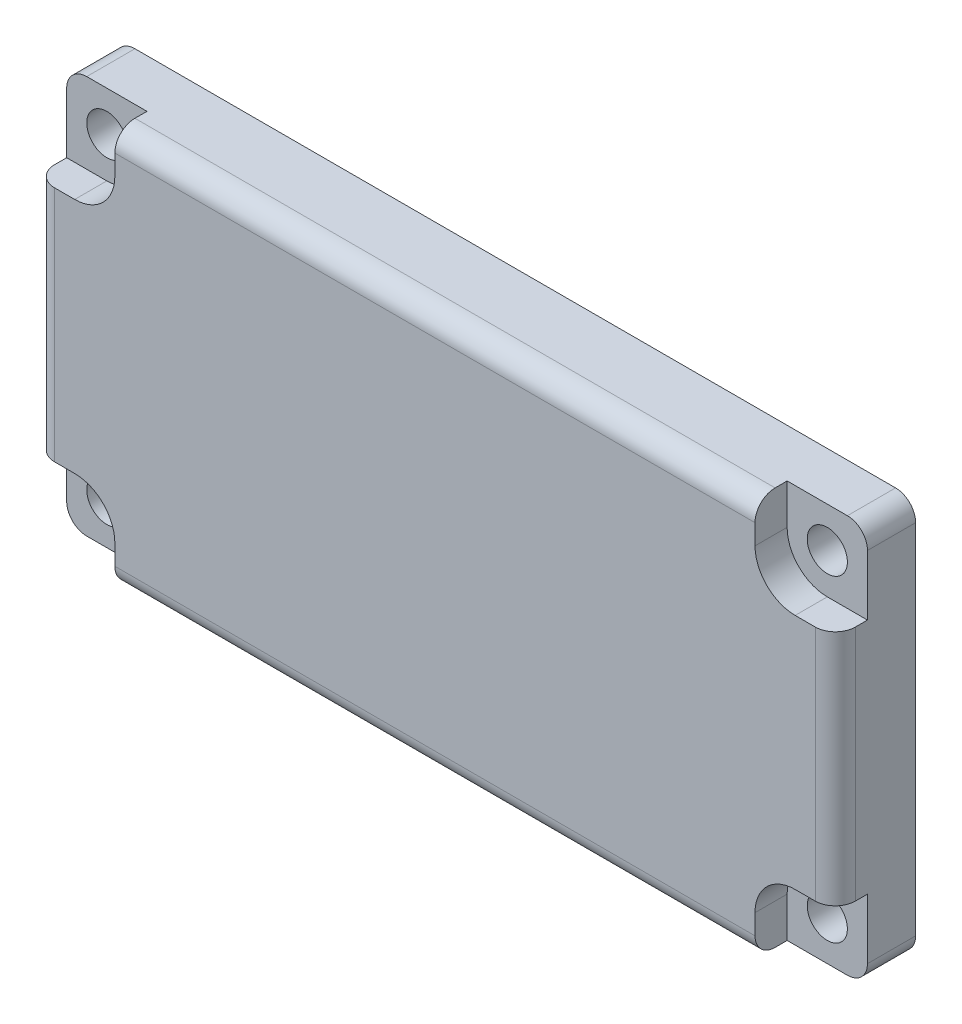
ISO-10303-21;
HEADER;
FILE_DESCRIPTION(('STEP AP214'),'2;1');
FILE_NAME('part.step','',(''),(''),'','','');
FILE_SCHEMA(('AUTOMOTIVE_DESIGN { 1 0 10303 214 1 1 1 1 }'));
ENDSEC;
DATA;
#1=APPLICATION_CONTEXT('core data for automotive mechanical design processes');
#2=APPLICATION_PROTOCOL_DEFINITION('international standard','automotive_design',2000,#1);
#3=PRODUCT_CONTEXT('',#1,'mechanical');
#4=PRODUCT('Part','Part','',(#3));
#5=PRODUCT_RELATED_PRODUCT_CATEGORY('part','',(#4));
#6=PRODUCT_DEFINITION_FORMATION('','',#4);
#7=PRODUCT_DEFINITION_CONTEXT('part definition',#1,'design');
#8=PRODUCT_DEFINITION('design','',#6,#7);
#9=PRODUCT_DEFINITION_SHAPE('','',#8);
#10=(LENGTH_UNIT() NAMED_UNIT(*) SI_UNIT(.MILLI.,.METRE.));
#11=(NAMED_UNIT(*) PLANE_ANGLE_UNIT() SI_UNIT($,.RADIAN.));
#12=(NAMED_UNIT(*) SI_UNIT($,.STERADIAN.) SOLID_ANGLE_UNIT());
#13=UNCERTAINTY_MEASURE_WITH_UNIT(LENGTH_MEASURE(1.E-05),#10,'distance_accuracy_value','');
#14=(GEOMETRIC_REPRESENTATION_CONTEXT(3) GLOBAL_UNCERTAINTY_ASSIGNED_CONTEXT((#13)) GLOBAL_UNIT_ASSIGNED_CONTEXT((#10,
#11,#12)) REPRESENTATION_CONTEXT('',''));
#15=CARTESIAN_POINT('',(0.,0.,0.));
#16=DIRECTION('',(0.,0.,1.));
#17=DIRECTION('',(1.,0.,0.));
#18=AXIS2_PLACEMENT_3D('',#15,#16,#17);
#19=CARTESIAN_POINT('',(19.94,-5.90999999999998,4.));
#20=DIRECTION('',(0.,-1.,0.));
#21=DIRECTION('',(0.,0.,-1.));
#22=AXIS2_PLACEMENT_3D('',#19,#20,#21);
#23=PLANE('',#22);
#24=DIRECTION('',(1.,0.,0.));
#25=VECTOR('',#24,1.);
#26=CARTESIAN_POINT('',(18.0777343274796,-5.90999999999998,2.4));
#27=LINE('',#26,#25);
#28=CARTESIAN_POINT('',(19.94,-5.90999999999998,2.4));
#29=VERTEX_POINT('',#28);
#30=CARTESIAN_POINT('',(17.94,-5.90999999999998,2.4));
#31=VERTEX_POINT('',#30);
#32=EDGE_CURVE('E172',#29,#31,#27,.F.);
#33=ORIENTED_EDGE('',*,*,#32,.F.);
#34=DIRECTION('',(0.,0.,-1.));
#35=VECTOR('',#34,1.);
#36=CARTESIAN_POINT('',(19.94,-5.90999999999998,4.));
#37=LINE('',#36,#35);
#38=CARTESIAN_POINT('',(19.94,-5.90999999999998,2.99999999999999));
#39=VERTEX_POINT('',#38);
#40=EDGE_CURVE('E170',#29,#39,#37,.F.);
#41=ORIENTED_EDGE('',*,*,#40,.T.);
#42=CARTESIAN_POINT('',(18.94,-5.90999999999998,2.99999999999999));
#43=DIRECTION('',(0.,-1.,0.));
#44=DIRECTION('',(0.,0.,-1.));
#45=AXIS2_PLACEMENT_3D('',#42,#43,#44);
#46=CIRCLE('',#45,1.);
#47=CARTESIAN_POINT('',(18.94,-5.90999999999998,4.));
#48=VERTEX_POINT('',#47);
#49=EDGE_CURVE('E20',#39,#48,#46,.T.);
#50=ORIENTED_EDGE('',*,*,#49,.T.);
#51=DIRECTION('',(1.,0.,0.));
#52=VECTOR('',#51,1.);
#53=CARTESIAN_POINT('',(19.94,-5.90999999999998,4.));
#54=LINE('',#53,#52);
#55=CARTESIAN_POINT('',(17.94,-5.90999999999998,4.));
#56=VERTEX_POINT('',#55);
#57=EDGE_CURVE('E152',#48,#56,#54,.F.);
#58=ORIENTED_EDGE('',*,*,#57,.T.);
#59=DIRECTION('',(0.,0.,-1.));
#60=VECTOR('',#59,1.);
#61=CARTESIAN_POINT('',(17.94,-5.90999999999998,4.));
#62=LINE('',#61,#60);
#63=EDGE_CURVE('E160',#56,#31,#62,.T.);
#64=ORIENTED_EDGE('',*,*,#63,.T.);
#65=EDGE_LOOP('',(#33,#41,#50,#58,#64));
#66=FACE_BOUND('',#65,.T.);
#67=ADVANCED_FACE('F17',(#66),#23,.T.);
#68=CARTESIAN_POINT('',(15.94,-7.90999999999999,4.));
#69=DIRECTION('',(1.,0.,0.));
#70=DIRECTION('',(0.,0.,-1.));
#71=AXIS2_PLACEMENT_3D('',#68,#69,#70);
#72=PLANE('',#71);
#73=DIRECTION('',(0.,0.,-1.));
#74=VECTOR('',#73,1.);
#75=CARTESIAN_POINT('',(15.94,-7.90999999999999,4.));
#76=LINE('',#75,#74);
#77=CARTESIAN_POINT('',(15.94,-7.90999999999999,2.4));
#78=VERTEX_POINT('',#77);
#79=CARTESIAN_POINT('',(15.94,-7.90999999999999,4.));
#80=VERTEX_POINT('',#79);
#81=EDGE_CURVE('E183',#78,#80,#76,.F.);
#82=ORIENTED_EDGE('',*,*,#81,.T.);
#83=DIRECTION('',(0.,1.,0.));
#84=VECTOR('',#83,1.);
#85=CARTESIAN_POINT('',(15.94,-7.90999999999999,4.));
#86=LINE('',#85,#84);
#87=CARTESIAN_POINT('',(15.94,-8.91,4.));
#88=VERTEX_POINT('',#87);
#89=EDGE_CURVE('E298',#80,#88,#86,.F.);
#90=ORIENTED_EDGE('',*,*,#89,.T.);
#91=CARTESIAN_POINT('',(15.94,-8.91,2.99999999999999));
#92=DIRECTION('',(-1.,0.,0.));
#93=DIRECTION('',(0.,-1.,0.));
#94=AXIS2_PLACEMENT_3D('',#91,#92,#93);
#95=CIRCLE('',#94,1.);
#96=CARTESIAN_POINT('',(15.94,-9.90999999999999,2.99999999999999));
#97=VERTEX_POINT('',#96);
#98=EDGE_CURVE('E176',#88,#97,#95,.F.);
#99=ORIENTED_EDGE('',*,*,#98,.T.);
#100=DIRECTION('',(0.,0.,-1.));
#101=VECTOR('',#100,1.);
#102=CARTESIAN_POINT('',(15.94,-9.90999999999999,4.));
#103=LINE('',#102,#101);
#104=CARTESIAN_POINT('',(15.94,-9.90999999999999,2.4));
#105=VERTEX_POINT('',#104);
#106=EDGE_CURVE('E179',#97,#105,#103,.T.);
#107=ORIENTED_EDGE('',*,*,#106,.T.);
#108=DIRECTION('',(0.,1.,0.));
#109=VECTOR('',#108,1.);
#110=CARTESIAN_POINT('',(15.94,-8.0477343274796,2.4));
#111=LINE('',#110,#109);
#112=EDGE_CURVE('E293',#78,#105,#111,.F.);
#113=ORIENTED_EDGE('',*,*,#112,.F.);
#114=EDGE_LOOP('',(#82,#90,#99,#107,#113));
#115=FACE_BOUND('',#114,.T.);
#116=ADVANCED_FACE('F314',(#115),#72,.T.);
#117=CARTESIAN_POINT('',(18.94,-8.91,0.));
#118=DIRECTION('',(0.,0.,1.));
#119=DIRECTION('',(1.,0.,0.));
#120=AXIS2_PLACEMENT_3D('',#117,#118,#119);
#121=CYLINDRICAL_SURFACE('',#120,1.);
#122=CARTESIAN_POINT('',(18.94,-8.91,0.));
#123=DIRECTION('',(0.,0.,1.));
#124=DIRECTION('',(1.,0.,0.));
#125=AXIS2_PLACEMENT_3D('',#122,#123,#124);
#126=CIRCLE('',#125,1.);
#127=CARTESIAN_POINT('',(18.94,-9.90999999999999,0.));
#128=VERTEX_POINT('',#127);
#129=CARTESIAN_POINT('',(19.94,-8.91,0.));
#130=VERTEX_POINT('',#129);
#131=EDGE_CURVE('E297',#128,#130,#126,.T.);
#132=ORIENTED_EDGE('',*,*,#131,.T.);
#133=DIRECTION('',(0.,0.,-1.));
#134=VECTOR('',#133,1.);
#135=CARTESIAN_POINT('',(19.94,-8.91,0.));
#136=LINE('',#135,#134);
#137=CARTESIAN_POINT('',(19.94,-8.91,2.4));
#138=VERTEX_POINT('',#137);
#139=EDGE_CURVE('E342',#138,#130,#136,.T.);
#140=ORIENTED_EDGE('',*,*,#139,.F.);
#141=CARTESIAN_POINT('',(18.94,-8.91,2.4));
#142=DIRECTION('',(0.,0.,1.));
#143=DIRECTION('',(1.,0.,0.));
#144=AXIS2_PLACEMENT_3D('',#141,#142,#143);
#145=CIRCLE('',#144,1.);
#146=CARTESIAN_POINT('',(18.94,-9.90999999999999,2.4));
#147=VERTEX_POINT('',#146);
#148=EDGE_CURVE('E294',#147,#138,#145,.T.);
#149=ORIENTED_EDGE('',*,*,#148,.F.);
#150=DIRECTION('',(0.,0.,-1.));
#151=VECTOR('',#150,1.);
#152=CARTESIAN_POINT('',(18.94,-9.90999999999999,0.));
#153=LINE('',#152,#151);
#154=EDGE_CURVE('E284',#128,#147,#153,.F.);
#155=ORIENTED_EDGE('',*,*,#154,.F.);
#156=EDGE_LOOP('',(#132,#140,#149,#155));
#157=FACE_BOUND('',#156,.T.);
#158=ADVANCED_FACE('F651',(#157),#121,.T.);
#159=CARTESIAN_POINT('',(18.0777343274796,-8.0477343274796,2.4));
#160=DIRECTION('',(0.,0.,1.));
#161=DIRECTION('',(1.,0.,0.));
#162=AXIS2_PLACEMENT_3D('',#159,#160,#161);
#163=PLANE('',#162);
#164=CARTESIAN_POINT('',(17.94,-7.90999999999999,2.40000000000001));
#165=DIRECTION('',(0.,0.,1.));
#166=DIRECTION('',(1.,0.,0.));
#167=AXIS2_PLACEMENT_3D('',#164,#165,#166);
#168=CIRCLE('',#167,0.999999999999987);
#169=CARTESIAN_POINT('',(18.94,-7.90999999999999,2.40000000000001));
#170=VERTEX_POINT('',#169);
#171=EDGE_CURVE('E281',#170,#170,#168,.T.);
#172=ORIENTED_EDGE('',*,*,#171,.F.);
#173=EDGE_LOOP('',(#172));
#174=FACE_BOUND('',#173,.T.);
#175=ORIENTED_EDGE('',*,*,#112,.T.);
#176=DIRECTION('',(1.,0.,0.));
#177=VECTOR('',#176,1.);
#178=CARTESIAN_POINT('',(19.94,-9.90999999999999,2.4));
#179=LINE('',#178,#177);
#180=EDGE_CURVE('E324',#147,#105,#179,.F.);
#181=ORIENTED_EDGE('',*,*,#180,.F.);
#182=ORIENTED_EDGE('',*,*,#148,.T.);
#183=DIRECTION('',(0.,1.,0.));
#184=VECTOR('',#183,1.);
#185=CARTESIAN_POINT('',(19.94,9.91000000000001,2.4));
#186=LINE('',#185,#184);
#187=EDGE_CURVE('E285',#29,#138,#186,.F.);
#188=ORIENTED_EDGE('',*,*,#187,.F.);
#189=ORIENTED_EDGE('',*,*,#32,.T.);
#190=CARTESIAN_POINT('',(17.94,-7.90999999999999,2.4));
#191=DIRECTION('',(0.,0.,-1.));
#192=DIRECTION('',(-1.,0.,0.));
#193=AXIS2_PLACEMENT_3D('',#190,#191,#192);
#194=CIRCLE('',#193,2.);
#195=EDGE_CURVE('E289',#78,#31,#194,.T.);
#196=ORIENTED_EDGE('',*,*,#195,.F.);
#197=EDGE_LOOP('',(#175,#181,#182,#188,#189,#196));
#198=FACE_BOUND('',#197,.T.);
#199=ADVANCED_FACE('F323',(#174,#198),#163,.T.);
#200=CARTESIAN_POINT('',(15.94,-8.91,2.99999999999999));
#201=DIRECTION('',(-1.,0.,0.));
#202=DIRECTION('',(0.,-1.,0.));
#203=AXIS2_PLACEMENT_3D('',#200,#201,#202);
#204=CYLINDRICAL_SURFACE('',#203,1.);
#205=ORIENTED_EDGE('',*,*,#98,.F.);
#206=DIRECTION('',(1.,0.,0.));
#207=VECTOR('',#206,1.);
#208=CARTESIAN_POINT('',(0.,-8.91,4.));
#209=LINE('',#208,#207);
#210=CARTESIAN_POINT('',(-15.94,-8.91,4.));
#211=VERTEX_POINT('',#210);
#212=EDGE_CURVE('E266',#211,#88,#209,.T.);
#213=ORIENTED_EDGE('',*,*,#212,.F.);
#214=CARTESIAN_POINT('',(-15.94,-8.91,2.99999999999999));
#215=DIRECTION('',(-1.,0.,0.));
#216=DIRECTION('',(0.,-1.,0.));
#217=AXIS2_PLACEMENT_3D('',#214,#215,#216);
#218=CIRCLE('',#217,1.);
#219=CARTESIAN_POINT('',(-15.94,-9.91,2.99999999999999));
#220=VERTEX_POINT('',#219);
#221=EDGE_CURVE('E277',#220,#211,#218,.T.);
#222=ORIENTED_EDGE('',*,*,#221,.F.);
#223=DIRECTION('',(1.,0.,0.));
#224=VECTOR('',#223,1.);
#225=CARTESIAN_POINT('',(19.94,-9.90999999999999,2.99999999999999));
#226=LINE('',#225,#224);
#227=EDGE_CURVE('E280',#97,#220,#226,.F.);
#228=ORIENTED_EDGE('',*,*,#227,.F.);
#229=EDGE_LOOP('',(#205,#213,#222,#228));
#230=FACE_BOUND('',#229,.T.);
#231=ADVANCED_FACE('F368',(#230),#204,.T.);
#232=CARTESIAN_POINT('',(17.94,-7.90999999999999,4.));
#233=DIRECTION('',(0.,0.,-1.));
#234=DIRECTION('',(-1.,0.,0.));
#235=AXIS2_PLACEMENT_3D('',#232,#233,#234);
#236=CYLINDRICAL_SURFACE('',#235,2.);
#237=CARTESIAN_POINT('',(17.94,-7.90999999999999,4.));
#238=DIRECTION('',(0.,0.,-1.));
#239=DIRECTION('',(-1.,0.,0.));
#240=AXIS2_PLACEMENT_3D('',#237,#238,#239);
#241=CIRCLE('',#240,2.);
#242=EDGE_CURVE('E158',#80,#56,#241,.T.);
#243=ORIENTED_EDGE('',*,*,#242,.F.);
#244=ORIENTED_EDGE('',*,*,#81,.F.);
#245=ORIENTED_EDGE('',*,*,#195,.T.);
#246=ORIENTED_EDGE('',*,*,#63,.F.);
#247=EDGE_LOOP('',(#243,#244,#245,#246));
#248=FACE_BOUND('',#247,.T.);
#249=ADVANCED_FACE('F366',(#248),#236,.F.);
#250=CARTESIAN_POINT('',(18.94,5.91000000000001,2.99999999999999));
#251=DIRECTION('',(0.,-1.,0.));
#252=DIRECTION('',(0.,0.,-1.));
#253=AXIS2_PLACEMENT_3D('',#250,#251,#252);
#254=CYLINDRICAL_SURFACE('',#253,1.);
#255=CARTESIAN_POINT('',(18.94,5.91000000000001,2.99999999999999));
#256=DIRECTION('',(0.,-1.,0.));
#257=DIRECTION('',(0.,0.,-1.));
#258=AXIS2_PLACEMENT_3D('',#255,#256,#257);
#259=CIRCLE('',#258,1.);
#260=CARTESIAN_POINT('',(18.94,5.91000000000001,4.));
#261=VERTEX_POINT('',#260);
#262=CARTESIAN_POINT('',(19.94,5.91000000000001,2.99999999999999));
#263=VERTEX_POINT('',#262);
#264=EDGE_CURVE('E163',#261,#263,#259,.F.);
#265=ORIENTED_EDGE('',*,*,#264,.F.);
#266=DIRECTION('',(0.,1.,0.));
#267=VECTOR('',#266,1.);
#268=CARTESIAN_POINT('',(18.94,0.,4.));
#269=LINE('',#268,#267);
#270=EDGE_CURVE('E156',#48,#261,#269,.T.);
#271=ORIENTED_EDGE('',*,*,#270,.F.);
#272=ORIENTED_EDGE('',*,*,#49,.F.);
#273=DIRECTION('',(0.,1.,0.));
#274=VECTOR('',#273,1.);
#275=CARTESIAN_POINT('',(19.94,9.91000000000001,2.99999999999999));
#276=LINE('',#275,#274);
#277=EDGE_CURVE('E308',#263,#39,#276,.F.);
#278=ORIENTED_EDGE('',*,*,#277,.F.);
#279=EDGE_LOOP('',(#265,#271,#272,#278));
#280=FACE_BOUND('',#279,.T.);
#281=ADVANCED_FACE('F162',(#280),#254,.T.);
#282=CARTESIAN_POINT('',(15.94,9.91000000000001,4.));
#283=DIRECTION('',(1.,0.,0.));
#284=DIRECTION('',(0.,0.,-1.));
#285=AXIS2_PLACEMENT_3D('',#282,#283,#284);
#286=PLANE('',#285);
#287=DIRECTION('',(0.,1.,0.));
#288=VECTOR('',#287,1.);
#289=CARTESIAN_POINT('',(15.94,8.04773432747962,2.4));
#290=LINE('',#289,#288);
#291=CARTESIAN_POINT('',(15.94,9.91000000000001,2.4));
#292=VERTEX_POINT('',#291);
#293=CARTESIAN_POINT('',(15.94,7.91000000000001,2.4));
#294=VERTEX_POINT('',#293);
#295=EDGE_CURVE('E249',#292,#294,#290,.F.);
#296=ORIENTED_EDGE('',*,*,#295,.F.);
#297=DIRECTION('',(0.,0.,-1.));
#298=VECTOR('',#297,1.);
#299=CARTESIAN_POINT('',(15.94,9.91000000000001,4.));
#300=LINE('',#299,#298);
#301=CARTESIAN_POINT('',(15.94,9.91000000000001,2.99999999999999));
#302=VERTEX_POINT('',#301);
#303=EDGE_CURVE('E292',#292,#302,#300,.F.);
#304=ORIENTED_EDGE('',*,*,#303,.T.);
#305=CARTESIAN_POINT('',(15.94,8.91,2.99999999999999));
#306=DIRECTION('',(1.,0.,0.));
#307=DIRECTION('',(0.,0.,-1.));
#308=AXIS2_PLACEMENT_3D('',#305,#306,#307);
#309=CIRCLE('',#308,1.);
#310=CARTESIAN_POINT('',(15.94,8.91,4.));
#311=VERTEX_POINT('',#310);
#312=EDGE_CURVE('E254',#311,#302,#309,.F.);
#313=ORIENTED_EDGE('',*,*,#312,.F.);
#314=DIRECTION('',(0.,1.,0.));
#315=VECTOR('',#314,1.);
#316=CARTESIAN_POINT('',(15.94,0.,4.));
#317=LINE('',#316,#315);
#318=CARTESIAN_POINT('',(15.94,7.91000000000001,4.));
#319=VERTEX_POINT('',#318);
#320=EDGE_CURVE('E264',#319,#311,#317,.T.);
#321=ORIENTED_EDGE('',*,*,#320,.F.);
#322=DIRECTION('',(0.,0.,1.));
#323=VECTOR('',#322,1.);
#324=CARTESIAN_POINT('',(15.94,7.91000000000001,3.20000000000001));
#325=LINE('',#324,#323);
#326=EDGE_CURVE('E288',#294,#319,#325,.T.);
#327=ORIENTED_EDGE('',*,*,#326,.F.);
#328=EDGE_LOOP('',(#296,#304,#313,#321,#327));
#329=FACE_BOUND('',#328,.T.);
#330=ADVANCED_FACE('F375',(#329),#286,.T.);
#331=CARTESIAN_POINT('',(17.94,7.91000000000001,4.));
#332=DIRECTION('',(0.,0.,-1.));
#333=DIRECTION('',(-1.,0.,0.));
#334=AXIS2_PLACEMENT_3D('',#331,#332,#333);
#335=CYLINDRICAL_SURFACE('',#334,1.99999999999998);
#336=CARTESIAN_POINT('',(17.94,7.91000000000001,4.));
#337=DIRECTION('',(0.,0.,-1.));
#338=DIRECTION('',(-1.,0.,0.));
#339=AXIS2_PLACEMENT_3D('',#336,#337,#338);
#340=CIRCLE('',#339,1.99999999999998);
#341=CARTESIAN_POINT('',(17.94,5.91000000000001,4.));
#342=VERTEX_POINT('',#341);
#343=EDGE_CURVE('E262',#342,#319,#340,.T.);
#344=ORIENTED_EDGE('',*,*,#343,.F.);
#345=DIRECTION('',(0.,0.,1.));
#346=VECTOR('',#345,1.);
#347=CARTESIAN_POINT('',(17.94,5.91000000000001,4.));
#348=LINE('',#347,#346);
#349=CARTESIAN_POINT('',(17.94,5.91000000000001,2.4));
#350=VERTEX_POINT('',#349);
#351=EDGE_CURVE('E287',#350,#342,#348,.T.);
#352=ORIENTED_EDGE('',*,*,#351,.F.);
#353=CARTESIAN_POINT('',(17.94,7.91000000000001,2.4));
#354=DIRECTION('',(0.,0.,-1.));
#355=DIRECTION('',(-1.,0.,0.));
#356=AXIS2_PLACEMENT_3D('',#353,#354,#355);
#357=CIRCLE('',#356,1.99999999999998);
#358=EDGE_CURVE('E245',#294,#350,#357,.F.);
#359=ORIENTED_EDGE('',*,*,#358,.F.);
#360=ORIENTED_EDGE('',*,*,#326,.T.);
#361=EDGE_LOOP('',(#344,#352,#359,#360));
#362=FACE_BOUND('',#361,.T.);
#363=ADVANCED_FACE('F475',(#362),#335,.F.);
#364=CARTESIAN_POINT('',(17.94,5.91000000000001,4.));
#365=DIRECTION('',(0.,1.,0.));
#366=DIRECTION('',(0.,0.,1.));
#367=AXIS2_PLACEMENT_3D('',#364,#365,#366);
#368=PLANE('',#367);
#369=ORIENTED_EDGE('',*,*,#351,.T.);
#370=DIRECTION('',(1.,0.,0.));
#371=VECTOR('',#370,1.);
#372=CARTESIAN_POINT('',(0.,5.91000000000001,4.));
#373=LINE('',#372,#371);
#374=EDGE_CURVE('E165',#261,#342,#373,.F.);
#375=ORIENTED_EDGE('',*,*,#374,.F.);
#376=ORIENTED_EDGE('',*,*,#264,.T.);
#377=DIRECTION('',(0.,0.,-1.));
#378=VECTOR('',#377,1.);
#379=CARTESIAN_POINT('',(19.94,5.91000000000001,0.));
#380=LINE('',#379,#378);
#381=CARTESIAN_POINT('',(19.94,5.91000000000001,2.4));
#382=VERTEX_POINT('',#381);
#383=EDGE_CURVE('E340',#382,#263,#380,.F.);
#384=ORIENTED_EDGE('',*,*,#383,.F.);
#385=DIRECTION('',(1.,0.,0.));
#386=VECTOR('',#385,1.);
#387=CARTESIAN_POINT('',(18.0777343274796,5.91000000000001,2.4));
#388=LINE('',#387,#386);
#389=EDGE_CURVE('E248',#350,#382,#388,.T.);
#390=ORIENTED_EDGE('',*,*,#389,.F.);
#391=EDGE_LOOP('',(#369,#375,#376,#384,#390));
#392=FACE_BOUND('',#391,.T.);
#393=ADVANCED_FACE('F472',(#392),#368,.T.);
#394=CARTESIAN_POINT('',(19.94,9.91000000000001,0.));
#395=DIRECTION('',(1.,0.,0.));
#396=DIRECTION('',(0.,0.,-1.));
#397=AXIS2_PLACEMENT_3D('',#394,#395,#396);
#398=PLANE('',#397);
#399=ORIENTED_EDGE('',*,*,#40,.F.);
#400=ORIENTED_EDGE('',*,*,#187,.T.);
#401=ORIENTED_EDGE('',*,*,#139,.T.);
#402=DIRECTION('',(0.,1.,0.));
#403=VECTOR('',#402,1.);
#404=CARTESIAN_POINT('',(19.94,0.,0.));
#405=LINE('',#404,#403);
#406=CARTESIAN_POINT('',(19.94,8.91,0.));
#407=VERTEX_POINT('',#406);
#408=EDGE_CURVE('E235',#407,#130,#405,.F.);
#409=ORIENTED_EDGE('',*,*,#408,.F.);
#410=DIRECTION('',(0.,0.,1.));
#411=VECTOR('',#410,1.);
#412=CARTESIAN_POINT('',(19.94,8.91,0.));
#413=LINE('',#412,#411);
#414=CARTESIAN_POINT('',(19.94,8.91,2.4));
#415=VERTEX_POINT('',#414);
#416=EDGE_CURVE('E237',#415,#407,#413,.F.);
#417=ORIENTED_EDGE('',*,*,#416,.F.);
#418=DIRECTION('',(0.,1.,0.));
#419=VECTOR('',#418,1.);
#420=CARTESIAN_POINT('',(19.94,8.04773432747962,2.4));
#421=LINE('',#420,#419);
#422=EDGE_CURVE('E244',#382,#415,#421,.T.);
#423=ORIENTED_EDGE('',*,*,#422,.F.);
#424=ORIENTED_EDGE('',*,*,#383,.T.);
#425=ORIENTED_EDGE('',*,*,#277,.T.);
#426=EDGE_LOOP('',(#399,#400,#401,#409,#417,#423,#424,#425));
#427=FACE_BOUND('',#426,.T.);
#428=ADVANCED_FACE('F468',(#427),#398,.T.);
#429=CARTESIAN_POINT('',(17.94,-7.90999999999999,0.));
#430=DIRECTION('',(0.,0.,1.));
#431=DIRECTION('',(1.,0.,0.));
#432=AXIS2_PLACEMENT_3D('',#429,#430,#431);
#433=CYLINDRICAL_SURFACE('',#432,0.999999999999987);
#434=ORIENTED_EDGE('',*,*,#171,.T.);
#435=EDGE_LOOP('',(#434));
#436=FACE_BOUND('',#435,.T.);
#437=CARTESIAN_POINT('',(17.94,-7.90999999999999,0.));
#438=DIRECTION('',(0.,0.,1.));
#439=DIRECTION('',(1.,0.,0.));
#440=AXIS2_PLACEMENT_3D('',#437,#438,#439);
#441=CIRCLE('',#440,0.999999999999987);
#442=CARTESIAN_POINT('',(18.94,-7.90999999999999,0.));
#443=VERTEX_POINT('',#442);
#444=EDGE_CURVE('E228',#443,#443,#441,.T.);
#445=ORIENTED_EDGE('',*,*,#444,.F.);
#446=EDGE_LOOP('',(#445));
#447=FACE_BOUND('',#446,.T.);
#448=ADVANCED_FACE('F464',(#436,#447),#433,.F.);
#449=CARTESIAN_POINT('',(17.94,7.91000000000001,0.));
#450=DIRECTION('',(0.,0.,1.));
#451=DIRECTION('',(1.,0.,0.));
#452=AXIS2_PLACEMENT_3D('',#449,#450,#451);
#453=CYLINDRICAL_SURFACE('',#452,1.00000000000001);
#454=CARTESIAN_POINT('',(17.94,7.91000000000001,2.40000000000001));
#455=DIRECTION('',(0.,0.,1.));
#456=DIRECTION('',(1.,0.,0.));
#457=AXIS2_PLACEMENT_3D('',#454,#455,#456);
#458=CIRCLE('',#457,1.00000000000001);
#459=CARTESIAN_POINT('',(18.94,7.91000000000001,2.40000000000001));
#460=VERTEX_POINT('',#459);
#461=EDGE_CURVE('E241',#460,#460,#458,.F.);
#462=ORIENTED_EDGE('',*,*,#461,.F.);
#463=EDGE_LOOP('',(#462));
#464=FACE_BOUND('',#463,.T.);
#465=CARTESIAN_POINT('',(17.94,7.91000000000001,0.));
#466=DIRECTION('',(0.,0.,1.));
#467=DIRECTION('',(1.,0.,0.));
#468=AXIS2_PLACEMENT_3D('',#465,#466,#467);
#469=CIRCLE('',#468,1.00000000000001);
#470=CARTESIAN_POINT('',(18.94,7.91000000000001,0.));
#471=VERTEX_POINT('',#470);
#472=EDGE_CURVE('E225',#471,#471,#469,.T.);
#473=ORIENTED_EDGE('',*,*,#472,.F.);
#474=EDGE_LOOP('',(#473));
#475=FACE_BOUND('',#474,.T.);
#476=ADVANCED_FACE('F461',(#464,#475),#453,.F.);
#477=CARTESIAN_POINT('',(19.94,-9.90999999999999,0.));
#478=DIRECTION('',(0.,-1.,0.));
#479=DIRECTION('',(0.,0.,-1.));
#480=AXIS2_PLACEMENT_3D('',#477,#478,#479);
#481=PLANE('',#480);
#482=DIRECTION('',(0.,0.,1.));
#483=VECTOR('',#482,1.);
#484=CARTESIAN_POINT('',(-18.94,-9.91,0.));
#485=LINE('',#484,#483);
#486=CARTESIAN_POINT('',(-18.94,-9.90999999999999,0.));
#487=VERTEX_POINT('',#486);
#488=CARTESIAN_POINT('',(-18.94,-9.91000000000001,2.4));
#489=VERTEX_POINT('',#488);
#490=EDGE_CURVE('E215',#487,#489,#485,.T.);
#491=ORIENTED_EDGE('',*,*,#490,.F.);
#492=DIRECTION('',(-1.,0.,0.));
#493=VECTOR('',#492,1.);
#494=CARTESIAN_POINT('',(0.,-9.90999999999999,0.));
#495=LINE('',#494,#493);
#496=EDGE_CURVE('E231',#128,#487,#495,.T.);
#497=ORIENTED_EDGE('',*,*,#496,.F.);
#498=ORIENTED_EDGE('',*,*,#154,.T.);
#499=ORIENTED_EDGE('',*,*,#180,.T.);
#500=ORIENTED_EDGE('',*,*,#106,.F.);
#501=ORIENTED_EDGE('',*,*,#227,.T.);
#502=DIRECTION('',(0.,0.,1.));
#503=VECTOR('',#502,1.);
#504=CARTESIAN_POINT('',(-15.94,-9.91000000000001,4.));
#505=LINE('',#504,#503);
#506=CARTESIAN_POINT('',(-15.94,-9.91000000000001,2.4));
#507=VERTEX_POINT('',#506);
#508=EDGE_CURVE('E279',#507,#220,#505,.T.);
#509=ORIENTED_EDGE('',*,*,#508,.F.);
#510=DIRECTION('',(1.,0.,0.));
#511=VECTOR('',#510,1.);
#512=CARTESIAN_POINT('',(-18.0777343274796,-9.91000000000001,2.4));
#513=LINE('',#512,#511);
#514=EDGE_CURVE('E214',#489,#507,#513,.T.);
#515=ORIENTED_EDGE('',*,*,#514,.F.);
#516=EDGE_LOOP('',(#491,#497,#498,#499,#500,#501,#509,#515));
#517=FACE_BOUND('',#516,.T.);
#518=ADVANCED_FACE('F328',(#517),#481,.T.);
#519=CARTESIAN_POINT('',(-15.94,-9.91000000000001,4.));
#520=DIRECTION('',(-1.,0.,0.));
#521=DIRECTION('',(0.,0.,1.));
#522=AXIS2_PLACEMENT_3D('',#519,#520,#521);
#523=PLANE('',#522);
#524=DIRECTION('',(0.,1.,0.));
#525=VECTOR('',#524,1.);
#526=CARTESIAN_POINT('',(-15.94,-8.0477343274796,2.4));
#527=LINE('',#526,#525);
#528=CARTESIAN_POINT('',(-15.94,-7.90999999999999,2.4));
#529=VERTEX_POINT('',#528);
#530=EDGE_CURVE('E210',#507,#529,#527,.T.);
#531=ORIENTED_EDGE('',*,*,#530,.F.);
#532=ORIENTED_EDGE('',*,*,#508,.T.);
#533=ORIENTED_EDGE('',*,*,#221,.T.);
#534=DIRECTION('',(0.,1.,0.));
#535=VECTOR('',#534,1.);
#536=CARTESIAN_POINT('',(-15.94,0.,4.));
#537=LINE('',#536,#535);
#538=CARTESIAN_POINT('',(-15.94,-7.90999999999999,4.));
#539=VERTEX_POINT('',#538);
#540=EDGE_CURVE('E270',#539,#211,#537,.F.);
#541=ORIENTED_EDGE('',*,*,#540,.F.);
#542=DIRECTION('',(0.,0.,1.));
#543=VECTOR('',#542,1.);
#544=CARTESIAN_POINT('',(-15.94,-7.90999999999999,3.20000000000001));
#545=LINE('',#544,#543);
#546=EDGE_CURVE('E276',#529,#539,#545,.T.);
#547=ORIENTED_EDGE('',*,*,#546,.F.);
#548=EDGE_LOOP('',(#531,#532,#533,#541,#547));
#549=FACE_BOUND('',#548,.T.);
#550=ADVANCED_FACE('F454',(#549),#523,.T.);
#551=CARTESIAN_POINT('',(-17.94,-7.90999999999999,4.));
#552=DIRECTION('',(0.,0.,-1.));
#553=DIRECTION('',(-1.,0.,0.));
#554=AXIS2_PLACEMENT_3D('',#551,#552,#553);
#555=CYLINDRICAL_SURFACE('',#554,2.00000000000001);
#556=CARTESIAN_POINT('',(-17.94,-7.90999999999999,4.));
#557=DIRECTION('',(0.,0.,-1.));
#558=DIRECTION('',(-1.,0.,0.));
#559=AXIS2_PLACEMENT_3D('',#556,#557,#558);
#560=CIRCLE('',#559,2.00000000000001);
#561=CARTESIAN_POINT('',(-17.94,-5.91000000000001,4.));
#562=VERTEX_POINT('',#561);
#563=EDGE_CURVE('E267',#562,#539,#560,.T.);
#564=ORIENTED_EDGE('',*,*,#563,.F.);
#565=DIRECTION('',(0.,0.,-1.));
#566=VECTOR('',#565,1.);
#567=CARTESIAN_POINT('',(-17.94,-5.91000000000001,4.));
#568=LINE('',#567,#566);
#569=CARTESIAN_POINT('',(-17.94,-5.91000000000001,2.4));
#570=VERTEX_POINT('',#569);
#571=EDGE_CURVE('E542',#570,#562,#568,.F.);
#572=ORIENTED_EDGE('',*,*,#571,.F.);
#573=CARTESIAN_POINT('',(-17.94,-7.90999999999999,2.4));
#574=DIRECTION('',(0.,0.,-1.));
#575=DIRECTION('',(-1.,0.,0.));
#576=AXIS2_PLACEMENT_3D('',#573,#574,#575);
#577=CIRCLE('',#576,2.00000000000001);
#578=EDGE_CURVE('E207',#529,#570,#577,.F.);
#579=ORIENTED_EDGE('',*,*,#578,.F.);
#580=ORIENTED_EDGE('',*,*,#546,.T.);
#581=EDGE_LOOP('',(#564,#572,#579,#580));
#582=FACE_BOUND('',#581,.T.);
#583=ADVANCED_FACE('F450',(#582),#555,.F.);
#584=CARTESIAN_POINT('',(-17.94,-5.91000000000001,4.));
#585=DIRECTION('',(0.,-1.,0.));
#586=DIRECTION('',(0.,0.,-1.));
#587=AXIS2_PLACEMENT_3D('',#584,#585,#586);
#588=PLANE('',#587);
#589=ORIENTED_EDGE('',*,*,#571,.T.);
#590=DIRECTION('',(1.,0.,0.));
#591=VECTOR('',#590,1.);
#592=CARTESIAN_POINT('',(0.,-5.91000000000001,4.));
#593=LINE('',#592,#591);
#594=CARTESIAN_POINT('',(-18.94,-5.91000000000001,4.));
#595=VERTEX_POINT('',#594);
#596=EDGE_CURVE('E271',#595,#562,#593,.T.);
#597=ORIENTED_EDGE('',*,*,#596,.F.);
#598=CARTESIAN_POINT('',(-18.94,-5.91000000000001,2.99999999999999));
#599=DIRECTION('',(0.,1.,0.));
#600=DIRECTION('',(0.,0.,1.));
#601=AXIS2_PLACEMENT_3D('',#598,#599,#600);
#602=CIRCLE('',#601,1.);
#603=CARTESIAN_POINT('',(-19.94,-5.91000000000001,2.99999999999999));
#604=VERTEX_POINT('',#603);
#605=EDGE_CURVE('E272',#595,#604,#602,.F.);
#606=ORIENTED_EDGE('',*,*,#605,.T.);
#607=DIRECTION('',(0.,0.,-1.));
#608=VECTOR('',#607,1.);
#609=CARTESIAN_POINT('',(-19.94,-5.91000000000001,4.));
#610=LINE('',#609,#608);
#611=CARTESIAN_POINT('',(-19.94,-5.91000000000001,2.4));
#612=VERTEX_POINT('',#611);
#613=EDGE_CURVE('E275',#604,#612,#610,.T.);
#614=ORIENTED_EDGE('',*,*,#613,.T.);
#615=DIRECTION('',(1.,0.,0.));
#616=VECTOR('',#615,1.);
#617=CARTESIAN_POINT('',(-18.0777343274796,-5.91000000000001,2.4));
#618=LINE('',#617,#616);
#619=EDGE_CURVE('E206',#570,#612,#618,.F.);
#620=ORIENTED_EDGE('',*,*,#619,.F.);
#621=EDGE_LOOP('',(#589,#597,#606,#614,#620));
#622=FACE_BOUND('',#621,.T.);
#623=ADVANCED_FACE('F446',(#622),#588,.T.);
#624=CARTESIAN_POINT('',(-17.94,-7.90999999999999,0.));
#625=DIRECTION('',(0.,0.,1.));
#626=DIRECTION('',(1.,0.,0.));
#627=AXIS2_PLACEMENT_3D('',#624,#625,#626);
#628=CYLINDRICAL_SURFACE('',#627,0.999999999999994);
#629=CARTESIAN_POINT('',(-17.94,-7.90999999999999,2.40000000000001));
#630=DIRECTION('',(0.,0.,1.));
#631=DIRECTION('',(1.,0.,0.));
#632=AXIS2_PLACEMENT_3D('',#629,#630,#631);
#633=CIRCLE('',#632,0.999999999999994);
#634=CARTESIAN_POINT('',(-16.94,-7.90999999999999,2.40000000000001));
#635=VERTEX_POINT('',#634);
#636=EDGE_CURVE('E203',#635,#635,#633,.F.);
#637=ORIENTED_EDGE('',*,*,#636,.F.);
#638=EDGE_LOOP('',(#637));
#639=FACE_BOUND('',#638,.T.);
#640=CARTESIAN_POINT('',(-17.94,-7.90999999999999,0.));
#641=DIRECTION('',(0.,0.,1.));
#642=DIRECTION('',(1.,0.,0.));
#643=AXIS2_PLACEMENT_3D('',#640,#641,#642);
#644=CIRCLE('',#643,0.999999999999994);
#645=CARTESIAN_POINT('',(-16.94,-7.90999999999999,0.));
#646=VERTEX_POINT('',#645);
#647=EDGE_CURVE('E219',#646,#646,#644,.T.);
#648=ORIENTED_EDGE('',*,*,#647,.F.);
#649=EDGE_LOOP('',(#648));
#650=FACE_BOUND('',#649,.T.);
#651=ADVANCED_FACE('F443',(#639,#650),#628,.F.);
#652=CARTESIAN_POINT('',(0.,0.,4.));
#653=DIRECTION('',(0.,0.,1.));
#654=DIRECTION('',(1.,0.,0.));
#655=AXIS2_PLACEMENT_3D('',#652,#653,#654);
#656=PLANE('',#655);
#657=ORIENTED_EDGE('',*,*,#343,.T.);
#658=ORIENTED_EDGE('',*,*,#320,.T.);
#659=DIRECTION('',(1.,0.,0.));
#660=VECTOR('',#659,1.);
#661=CARTESIAN_POINT('',(-9.97,8.91,3.99999999999999));
#662=LINE('',#661,#660);
#663=CARTESIAN_POINT('',(-15.94,8.91,4.));
#664=VERTEX_POINT('',#663);
#665=EDGE_CURVE('E253',#664,#311,#662,.T.);
#666=ORIENTED_EDGE('',*,*,#665,.F.);
#667=DIRECTION('',(0.,1.,0.));
#668=VECTOR('',#667,1.);
#669=CARTESIAN_POINT('',(-15.94,7.91000000000001,4.));
#670=LINE('',#669,#668);
#671=CARTESIAN_POINT('',(-15.94,7.91000000000001,4.));
#672=VERTEX_POINT('',#671);
#673=EDGE_CURVE('E257',#672,#664,#670,.T.);
#674=ORIENTED_EDGE('',*,*,#673,.F.);
#675=CARTESIAN_POINT('',(-17.94,7.91000000000001,4.));
#676=DIRECTION('',(0.,0.,-1.));
#677=DIRECTION('',(-1.,0.,0.));
#678=AXIS2_PLACEMENT_3D('',#675,#676,#677);
#679=CIRCLE('',#678,2.);
#680=CARTESIAN_POINT('',(-17.94,5.91000000000001,4.));
#681=VERTEX_POINT('',#680);
#682=EDGE_CURVE('E258',#681,#672,#679,.F.);
#683=ORIENTED_EDGE('',*,*,#682,.F.);
#684=DIRECTION('',(1.,0.,0.));
#685=VECTOR('',#684,1.);
#686=CARTESIAN_POINT('',(-19.94,5.91000000000001,4.));
#687=LINE('',#686,#685);
#688=CARTESIAN_POINT('',(-18.94,5.91000000000001,4.));
#689=VERTEX_POINT('',#688);
#690=EDGE_CURVE('E531',#689,#681,#687,.T.);
#691=ORIENTED_EDGE('',*,*,#690,.F.);
#692=DIRECTION('',(0.,1.,0.));
#693=VECTOR('',#692,1.);
#694=CARTESIAN_POINT('',(-18.94,-4.95499999999999,3.99999999999999));
#695=LINE('',#694,#693);
#696=EDGE_CURVE('E199',#595,#689,#695,.T.);
#697=ORIENTED_EDGE('',*,*,#696,.F.);
#698=ORIENTED_EDGE('',*,*,#596,.T.);
#699=ORIENTED_EDGE('',*,*,#563,.T.);
#700=ORIENTED_EDGE('',*,*,#540,.T.);
#701=ORIENTED_EDGE('',*,*,#212,.T.);
#702=ORIENTED_EDGE('',*,*,#89,.F.);
#703=ORIENTED_EDGE('',*,*,#242,.T.);
#704=ORIENTED_EDGE('',*,*,#57,.F.);
#705=ORIENTED_EDGE('',*,*,#270,.T.);
#706=ORIENTED_EDGE('',*,*,#374,.T.);
#707=EDGE_LOOP('',(#657,#658,#666,#674,#683,#691,#697,#698,#699,#700,#701,#702,#703,#704,#705,#706));
#708=FACE_BOUND('',#707,.T.);
#709=ADVANCED_FACE('F154',(#708),#656,.T.);
#710=CARTESIAN_POINT('',(-19.94,5.91000000000001,4.));
#711=DIRECTION('',(0.,1.,0.));
#712=DIRECTION('',(0.,0.,1.));
#713=AXIS2_PLACEMENT_3D('',#710,#711,#712);
#714=PLANE('',#713);
#715=DIRECTION('',(1.,0.,0.));
#716=VECTOR('',#715,1.);
#717=CARTESIAN_POINT('',(-18.0777343274796,5.91000000000001,2.4));
#718=LINE('',#717,#716);
#719=CARTESIAN_POINT('',(-19.94,5.91000000000001,2.4));
#720=VERTEX_POINT('',#719);
#721=CARTESIAN_POINT('',(-17.94,5.91000000000001,2.4));
#722=VERTEX_POINT('',#721);
#723=EDGE_CURVE('E195',#720,#722,#718,.T.);
#724=ORIENTED_EDGE('',*,*,#723,.F.);
#725=DIRECTION('',(0.,0.,1.));
#726=VECTOR('',#725,1.);
#727=CARTESIAN_POINT('',(-19.94,5.91000000000001,4.));
#728=LINE('',#727,#726);
#729=CARTESIAN_POINT('',(-19.94,5.91000000000001,2.99999999999999));
#730=VERTEX_POINT('',#729);
#731=EDGE_CURVE('E528',#720,#730,#728,.T.);
#732=ORIENTED_EDGE('',*,*,#731,.T.);
#733=CARTESIAN_POINT('',(-18.94,5.91000000000001,2.99999999999999));
#734=DIRECTION('',(0.,1.,0.));
#735=DIRECTION('',(0.,0.,1.));
#736=AXIS2_PLACEMENT_3D('',#733,#734,#735);
#737=CIRCLE('',#736,1.);
#738=EDGE_CURVE('E200',#689,#730,#737,.F.);
#739=ORIENTED_EDGE('',*,*,#738,.F.);
#740=ORIENTED_EDGE('',*,*,#690,.T.);
#741=DIRECTION('',(0.,0.,1.));
#742=VECTOR('',#741,1.);
#743=CARTESIAN_POINT('',(-17.94,5.91000000000001,3.20000000000001));
#744=LINE('',#743,#742);
#745=EDGE_CURVE('E261',#722,#681,#744,.T.);
#746=ORIENTED_EDGE('',*,*,#745,.F.);
#747=EDGE_LOOP('',(#724,#732,#739,#740,#746));
#748=FACE_BOUND('',#747,.T.);
#749=ADVANCED_FACE('F436',(#748),#714,.T.);
#750=CARTESIAN_POINT('',(-17.94,7.91000000000001,4.));
#751=DIRECTION('',(0.,0.,-1.));
#752=DIRECTION('',(-1.,0.,0.));
#753=AXIS2_PLACEMENT_3D('',#750,#751,#752);
#754=CYLINDRICAL_SURFACE('',#753,2.);
#755=ORIENTED_EDGE('',*,*,#682,.T.);
#756=DIRECTION('',(0.,0.,1.));
#757=VECTOR('',#756,1.);
#758=CARTESIAN_POINT('',(-15.94,7.91000000000001,4.));
#759=LINE('',#758,#757);
#760=CARTESIAN_POINT('',(-15.94,7.91000000000001,2.4));
#761=VERTEX_POINT('',#760);
#762=EDGE_CURVE('E519',#761,#672,#759,.T.);
#763=ORIENTED_EDGE('',*,*,#762,.F.);
#764=CARTESIAN_POINT('',(-17.94,7.91000000000001,2.4));
#765=DIRECTION('',(0.,0.,-1.));
#766=DIRECTION('',(-1.,0.,0.));
#767=AXIS2_PLACEMENT_3D('',#764,#765,#766);
#768=CIRCLE('',#767,2.);
#769=EDGE_CURVE('E192',#722,#761,#768,.F.);
#770=ORIENTED_EDGE('',*,*,#769,.F.);
#771=ORIENTED_EDGE('',*,*,#745,.T.);
#772=EDGE_LOOP('',(#755,#763,#770,#771));
#773=FACE_BOUND('',#772,.T.);
#774=ADVANCED_FACE('F432',(#773),#754,.F.);
#775=CARTESIAN_POINT('',(-15.94,7.91000000000001,4.));
#776=DIRECTION('',(-1.,0.,0.));
#777=DIRECTION('',(0.,0.,1.));
#778=AXIS2_PLACEMENT_3D('',#775,#776,#777);
#779=PLANE('',#778);
#780=ORIENTED_EDGE('',*,*,#762,.T.);
#781=ORIENTED_EDGE('',*,*,#673,.T.);
#782=CARTESIAN_POINT('',(-15.94,8.91,2.99999999999999));
#783=DIRECTION('',(1.,0.,0.));
#784=DIRECTION('',(0.,0.,-1.));
#785=AXIS2_PLACEMENT_3D('',#782,#783,#784);
#786=CIRCLE('',#785,1.);
#787=CARTESIAN_POINT('',(-15.94,9.91000000000001,2.99999999999999));
#788=VERTEX_POINT('',#787);
#789=EDGE_CURVE('E250',#788,#664,#786,.T.);
#790=ORIENTED_EDGE('',*,*,#789,.F.);
#791=DIRECTION('',(0.,0.,1.));
#792=VECTOR('',#791,1.);
#793=CARTESIAN_POINT('',(-15.94,9.91000000000001,4.));
#794=LINE('',#793,#792);
#795=CARTESIAN_POINT('',(-15.94,9.91000000000001,2.4));
#796=VERTEX_POINT('',#795);
#797=EDGE_CURVE('E260',#788,#796,#794,.F.);
#798=ORIENTED_EDGE('',*,*,#797,.T.);
#799=DIRECTION('',(0.,1.,0.));
#800=VECTOR('',#799,1.);
#801=CARTESIAN_POINT('',(-15.94,8.04773432747962,2.4));
#802=LINE('',#801,#800);
#803=EDGE_CURVE('E191',#761,#796,#802,.T.);
#804=ORIENTED_EDGE('',*,*,#803,.F.);
#805=EDGE_LOOP('',(#780,#781,#790,#798,#804));
#806=FACE_BOUND('',#805,.T.);
#807=ADVANCED_FACE('F428',(#806),#779,.T.);
#808=CARTESIAN_POINT('',(-17.94,7.91000000000001,0.));
#809=DIRECTION('',(0.,0.,1.));
#810=DIRECTION('',(1.,0.,0.));
#811=AXIS2_PLACEMENT_3D('',#808,#809,#810);
#812=CYLINDRICAL_SURFACE('',#811,1.00000000000002);
#813=CARTESIAN_POINT('',(-17.94,7.91000000000001,2.40000000000001));
#814=DIRECTION('',(0.,0.,1.));
#815=DIRECTION('',(1.,0.,0.));
#816=AXIS2_PLACEMENT_3D('',#813,#814,#815);
#817=CIRCLE('',#816,1.00000000000002);
#818=CARTESIAN_POINT('',(-16.94,7.91000000000001,2.40000000000001));
#819=VERTEX_POINT('',#818);
#820=EDGE_CURVE('E187',#819,#819,#817,.F.);
#821=ORIENTED_EDGE('',*,*,#820,.F.);
#822=EDGE_LOOP('',(#821));
#823=FACE_BOUND('',#822,.T.);
#824=CARTESIAN_POINT('',(-17.94,7.91000000000001,0.));
#825=DIRECTION('',(0.,0.,1.));
#826=DIRECTION('',(1.,0.,0.));
#827=AXIS2_PLACEMENT_3D('',#824,#825,#826);
#828=CIRCLE('',#827,1.00000000000002);
#829=CARTESIAN_POINT('',(-16.94,7.91000000000001,0.));
#830=VERTEX_POINT('',#829);
#831=EDGE_CURVE('E222',#830,#830,#828,.T.);
#832=ORIENTED_EDGE('',*,*,#831,.F.);
#833=EDGE_LOOP('',(#832));
#834=FACE_BOUND('',#833,.T.);
#835=ADVANCED_FACE('F424',(#823,#834),#812,.F.);
#836=CARTESIAN_POINT('',(-15.94,8.91,2.99999999999999));
#837=DIRECTION('',(1.,0.,0.));
#838=DIRECTION('',(0.,0.,-1.));
#839=AXIS2_PLACEMENT_3D('',#836,#837,#838);
#840=CYLINDRICAL_SURFACE('',#839,1.);
#841=ORIENTED_EDGE('',*,*,#789,.T.);
#842=ORIENTED_EDGE('',*,*,#665,.T.);
#843=ORIENTED_EDGE('',*,*,#312,.T.);
#844=DIRECTION('',(1.,0.,0.));
#845=VECTOR('',#844,1.);
#846=CARTESIAN_POINT('',(-19.94,9.91000000000001,2.99999999999999));
#847=LINE('',#846,#845);
#848=EDGE_CURVE('E356',#788,#302,#847,.T.);
#849=ORIENTED_EDGE('',*,*,#848,.F.);
#850=EDGE_LOOP('',(#841,#842,#843,#849));
#851=FACE_BOUND('',#850,.T.);
#852=ADVANCED_FACE('F420',(#851),#840,.T.);
#853=CARTESIAN_POINT('',(18.0777343274796,8.04773432747962,2.4));
#854=DIRECTION('',(0.,0.,1.));
#855=DIRECTION('',(1.,0.,0.));
#856=AXIS2_PLACEMENT_3D('',#853,#854,#855);
#857=PLANE('',#856);
#858=ORIENTED_EDGE('',*,*,#461,.T.);
#859=EDGE_LOOP('',(#858));
#860=FACE_BOUND('',#859,.T.);
#861=ORIENTED_EDGE('',*,*,#389,.T.);
#862=ORIENTED_EDGE('',*,*,#422,.T.);
#863=CARTESIAN_POINT('',(18.94,8.91,2.4));
#864=DIRECTION('',(0.,0.,1.));
#865=DIRECTION('',(1.,0.,0.));
#866=AXIS2_PLACEMENT_3D('',#863,#864,#865);
#867=CIRCLE('',#866,1.);
#868=CARTESIAN_POINT('',(18.94,9.91000000000001,2.4));
#869=VERTEX_POINT('',#868);
#870=EDGE_CURVE('E238',#869,#415,#867,.F.);
#871=ORIENTED_EDGE('',*,*,#870,.F.);
#872=DIRECTION('',(1.,0.,0.));
#873=VECTOR('',#872,1.);
#874=CARTESIAN_POINT('',(-19.94,9.91000000000001,2.4));
#875=LINE('',#874,#873);
#876=EDGE_CURVE('E359',#292,#869,#875,.T.);
#877=ORIENTED_EDGE('',*,*,#876,.F.);
#878=ORIENTED_EDGE('',*,*,#295,.T.);
#879=ORIENTED_EDGE('',*,*,#358,.T.);
#880=EDGE_LOOP('',(#861,#862,#871,#877,#878,#879));
#881=FACE_BOUND('',#880,.T.);
#882=ADVANCED_FACE('F416',(#860,#881),#857,.T.);
#883=CARTESIAN_POINT('',(18.94,8.91,0.));
#884=DIRECTION('',(0.,0.,1.));
#885=DIRECTION('',(1.,0.,0.));
#886=AXIS2_PLACEMENT_3D('',#883,#884,#885);
#887=CYLINDRICAL_SURFACE('',#886,1.);
#888=CARTESIAN_POINT('',(18.94,8.91,0.));
#889=DIRECTION('',(0.,0.,1.));
#890=DIRECTION('',(1.,0.,0.));
#891=AXIS2_PLACEMENT_3D('',#888,#889,#890);
#892=CIRCLE('',#891,1.);
#893=CARTESIAN_POINT('',(18.94,9.91000000000001,0.));
#894=VERTEX_POINT('',#893);
#895=EDGE_CURVE('E232',#894,#407,#892,.F.);
#896=ORIENTED_EDGE('',*,*,#895,.F.);
#897=DIRECTION('',(0.,0.,1.));
#898=VECTOR('',#897,1.);
#899=CARTESIAN_POINT('',(18.94,9.91000000000001,0.));
#900=LINE('',#899,#898);
#901=EDGE_CURVE('E497',#869,#894,#900,.F.);
#902=ORIENTED_EDGE('',*,*,#901,.F.);
#903=ORIENTED_EDGE('',*,*,#870,.T.);
#904=ORIENTED_EDGE('',*,*,#416,.T.);
#905=EDGE_LOOP('',(#896,#902,#903,#904));
#906=FACE_BOUND('',#905,.T.);
#907=ADVANCED_FACE('F412',(#906),#887,.T.);
#908=CARTESIAN_POINT('',(0.,0.,0.));
#909=DIRECTION('',(0.,0.,-1.));
#910=DIRECTION('',(-1.,0.,0.));
#911=AXIS2_PLACEMENT_3D('',#908,#909,#910);
#912=PLANE('',#911);
#913=ORIENTED_EDGE('',*,*,#647,.T.);
#914=EDGE_LOOP('',(#913));
#915=FACE_BOUND('',#914,.T.);
#916=ORIENTED_EDGE('',*,*,#831,.T.);
#917=EDGE_LOOP('',(#916));
#918=FACE_BOUND('',#917,.T.);
#919=ORIENTED_EDGE('',*,*,#472,.T.);
#920=EDGE_LOOP('',(#919));
#921=FACE_BOUND('',#920,.T.);
#922=ORIENTED_EDGE('',*,*,#444,.T.);
#923=EDGE_LOOP('',(#922));
#924=FACE_BOUND('',#923,.T.);
#925=CARTESIAN_POINT('',(-18.94,-8.91,0.));
#926=DIRECTION('',(0.,0.,1.));
#927=DIRECTION('',(1.,0.,0.));
#928=AXIS2_PLACEMENT_3D('',#925,#926,#927);
#929=CIRCLE('',#928,1.);
#930=CARTESIAN_POINT('',(-19.94,-8.91,0.));
#931=VERTEX_POINT('',#930);
#932=EDGE_CURVE('E216',#931,#487,#929,.T.);
#933=ORIENTED_EDGE('',*,*,#932,.F.);
#934=DIRECTION('',(0.,1.,0.));
#935=VECTOR('',#934,1.);
#936=CARTESIAN_POINT('',(-19.94,-9.91000000000001,0.));
#937=LINE('',#936,#935);
#938=CARTESIAN_POINT('',(-19.94,8.91,0.));
#939=VERTEX_POINT('',#938);
#940=EDGE_CURVE('E588',#939,#931,#937,.F.);
#941=ORIENTED_EDGE('',*,*,#940,.F.);
#942=CARTESIAN_POINT('',(-18.94,8.91,0.));
#943=DIRECTION('',(0.,0.,1.));
#944=DIRECTION('',(1.,0.,0.));
#945=AXIS2_PLACEMENT_3D('',#942,#943,#944);
#946=CIRCLE('',#945,1.);
#947=CARTESIAN_POINT('',(-18.94,9.91000000000001,0.));
#948=VERTEX_POINT('',#947);
#949=EDGE_CURVE('E34',#939,#948,#946,.F.);
#950=ORIENTED_EDGE('',*,*,#949,.T.);
#951=DIRECTION('',(1.,0.,0.));
#952=VECTOR('',#951,1.);
#953=CARTESIAN_POINT('',(-19.94,9.91000000000001,0.));
#954=LINE('',#953,#952);
#955=EDGE_CURVE('E499',#894,#948,#954,.F.);
#956=ORIENTED_EDGE('',*,*,#955,.F.);
#957=ORIENTED_EDGE('',*,*,#895,.T.);
#958=ORIENTED_EDGE('',*,*,#408,.T.);
#959=ORIENTED_EDGE('',*,*,#131,.F.);
#960=ORIENTED_EDGE('',*,*,#496,.T.);
#961=EDGE_LOOP('',(#933,#941,#950,#956,#957,#958,#959,#960));
#962=FACE_BOUND('',#961,.T.);
#963=ADVANCED_FACE('F408',(#915,#918,#921,#924,#962),#912,.T.);
#964=CARTESIAN_POINT('',(-18.94,-8.91,0.));
#965=DIRECTION('',(0.,0.,1.));
#966=DIRECTION('',(1.,0.,0.));
#967=AXIS2_PLACEMENT_3D('',#964,#965,#966);
#968=CYLINDRICAL_SURFACE('',#967,1.);
#969=ORIENTED_EDGE('',*,*,#932,.T.);
#970=ORIENTED_EDGE('',*,*,#490,.T.);
#971=CARTESIAN_POINT('',(-18.94,-8.91,2.4));
#972=DIRECTION('',(0.,0.,1.));
#973=DIRECTION('',(1.,0.,0.));
#974=AXIS2_PLACEMENT_3D('',#971,#972,#973);
#975=CIRCLE('',#974,1.);
#976=CARTESIAN_POINT('',(-19.94,-8.91,2.4));
#977=VERTEX_POINT('',#976);
#978=EDGE_CURVE('E211',#977,#489,#975,.T.);
#979=ORIENTED_EDGE('',*,*,#978,.F.);
#980=DIRECTION('',(0.,0.,1.));
#981=VECTOR('',#980,1.);
#982=CARTESIAN_POINT('',(-19.94,-8.91,0.));
#983=LINE('',#982,#981);
#984=EDGE_CURVE('E583',#931,#977,#983,.T.);
#985=ORIENTED_EDGE('',*,*,#984,.F.);
#986=EDGE_LOOP('',(#969,#970,#979,#985));
#987=FACE_BOUND('',#986,.T.);
#988=ADVANCED_FACE('F404',(#987),#968,.T.);
#989=CARTESIAN_POINT('',(-18.0777343274796,-8.0477343274796,2.4));
#990=DIRECTION('',(0.,0.,1.));
#991=DIRECTION('',(1.,0.,0.));
#992=AXIS2_PLACEMENT_3D('',#989,#990,#991);
#993=PLANE('',#992);
#994=ORIENTED_EDGE('',*,*,#636,.T.);
#995=EDGE_LOOP('',(#994));
#996=FACE_BOUND('',#995,.T.);
#997=ORIENTED_EDGE('',*,*,#619,.T.);
#998=DIRECTION('',(0.,1.,0.));
#999=VECTOR('',#998,1.);
#1000=CARTESIAN_POINT('',(-19.94,-9.91000000000001,2.4));
#1001=LINE('',#1000,#999);
#1002=EDGE_CURVE('E549',#977,#612,#1001,.T.);
#1003=ORIENTED_EDGE('',*,*,#1002,.F.);
#1004=ORIENTED_EDGE('',*,*,#978,.T.);
#1005=ORIENTED_EDGE('',*,*,#514,.T.);
#1006=ORIENTED_EDGE('',*,*,#530,.T.);
#1007=ORIENTED_EDGE('',*,*,#578,.T.);
#1008=EDGE_LOOP('',(#997,#1003,#1004,#1005,#1006,#1007));
#1009=FACE_BOUND('',#1008,.T.);
#1010=ADVANCED_FACE('F400',(#996,#1009),#993,.T.);
#1011=CARTESIAN_POINT('',(-18.94,-5.91000000000001,2.99999999999999));
#1012=DIRECTION('',(0.,1.,0.));
#1013=DIRECTION('',(0.,0.,1.));
#1014=AXIS2_PLACEMENT_3D('',#1011,#1012,#1013);
#1015=CYLINDRICAL_SURFACE('',#1014,1.);
#1016=ORIENTED_EDGE('',*,*,#605,.F.);
#1017=ORIENTED_EDGE('',*,*,#696,.T.);
#1018=ORIENTED_EDGE('',*,*,#738,.T.);
#1019=DIRECTION('',(0.,1.,0.));
#1020=VECTOR('',#1019,1.);
#1021=CARTESIAN_POINT('',(-19.94,-9.91000000000001,2.99999999999999));
#1022=LINE('',#1021,#1020);
#1023=EDGE_CURVE('E545',#604,#730,#1022,.T.);
#1024=ORIENTED_EDGE('',*,*,#1023,.F.);
#1025=EDGE_LOOP('',(#1016,#1017,#1018,#1024));
#1026=FACE_BOUND('',#1025,.T.);
#1027=ADVANCED_FACE('F396',(#1026),#1015,.T.);
#1028=CARTESIAN_POINT('',(-18.0777343274796,8.04773432747962,2.4));
#1029=DIRECTION('',(0.,0.,1.));
#1030=DIRECTION('',(1.,0.,0.));
#1031=AXIS2_PLACEMENT_3D('',#1028,#1029,#1030);
#1032=PLANE('',#1031);
#1033=ORIENTED_EDGE('',*,*,#820,.T.);
#1034=EDGE_LOOP('',(#1033));
#1035=FACE_BOUND('',#1034,.T.);
#1036=ORIENTED_EDGE('',*,*,#803,.T.);
#1037=DIRECTION('',(1.,0.,0.));
#1038=VECTOR('',#1037,1.);
#1039=CARTESIAN_POINT('',(-19.94,9.91000000000001,2.4));
#1040=LINE('',#1039,#1038);
#1041=CARTESIAN_POINT('',(-18.94,9.91000000000001,2.4));
#1042=VERTEX_POINT('',#1041);
#1043=EDGE_CURVE('E190',#1042,#796,#1040,.T.);
#1044=ORIENTED_EDGE('',*,*,#1043,.F.);
#1045=CARTESIAN_POINT('',(-18.94,8.91,2.4));
#1046=DIRECTION('',(0.,0.,1.));
#1047=DIRECTION('',(1.,0.,0.));
#1048=AXIS2_PLACEMENT_3D('',#1045,#1046,#1047);
#1049=CIRCLE('',#1048,1.);
#1050=CARTESIAN_POINT('',(-19.94,8.91,2.4));
#1051=VERTEX_POINT('',#1050);
#1052=EDGE_CURVE('E196',#1042,#1051,#1049,.T.);
#1053=ORIENTED_EDGE('',*,*,#1052,.T.);
#1054=DIRECTION('',(0.,1.,0.));
#1055=VECTOR('',#1054,1.);
#1056=CARTESIAN_POINT('',(-19.94,-9.91000000000001,2.4));
#1057=LINE('',#1056,#1055);
#1058=EDGE_CURVE('E548',#720,#1051,#1057,.T.);
#1059=ORIENTED_EDGE('',*,*,#1058,.F.);
#1060=ORIENTED_EDGE('',*,*,#723,.T.);
#1061=ORIENTED_EDGE('',*,*,#769,.T.);
#1062=EDGE_LOOP('',(#1036,#1044,#1053,#1059,#1060,#1061));
#1063=FACE_BOUND('',#1062,.T.);
#1064=ADVANCED_FACE('F392',(#1035,#1063),#1032,.T.);
#1065=CARTESIAN_POINT('',(-19.94,9.91000000000001,0.));
#1066=DIRECTION('',(0.,1.,0.));
#1067=DIRECTION('',(0.,0.,1.));
#1068=AXIS2_PLACEMENT_3D('',#1065,#1066,#1067);
#1069=PLANE('',#1068);
#1070=ORIENTED_EDGE('',*,*,#901,.T.);
#1071=ORIENTED_EDGE('',*,*,#955,.T.);
#1072=DIRECTION('',(0.,0.,1.));
#1073=VECTOR('',#1072,1.);
#1074=CARTESIAN_POINT('',(-18.94,9.91,0.));
#1075=LINE('',#1074,#1073);
#1076=EDGE_CURVE('E26',#1042,#948,#1075,.F.);
#1077=ORIENTED_EDGE('',*,*,#1076,.F.);
#1078=ORIENTED_EDGE('',*,*,#1043,.T.);
#1079=ORIENTED_EDGE('',*,*,#797,.F.);
#1080=ORIENTED_EDGE('',*,*,#848,.T.);
#1081=ORIENTED_EDGE('',*,*,#303,.F.);
#1082=ORIENTED_EDGE('',*,*,#876,.T.);
#1083=EDGE_LOOP('',(#1070,#1071,#1077,#1078,#1079,#1080,#1081,#1082));
#1084=FACE_BOUND('',#1083,.T.);
#1085=ADVANCED_FACE('F386',(#1084),#1069,.T.);
#1086=CARTESIAN_POINT('',(-19.94,-9.91000000000001,0.));
#1087=DIRECTION('',(-1.,0.,0.));
#1088=DIRECTION('',(0.,0.,1.));
#1089=AXIS2_PLACEMENT_3D('',#1086,#1087,#1088);
#1090=PLANE('',#1089);
#1091=ORIENTED_EDGE('',*,*,#731,.F.);
#1092=ORIENTED_EDGE('',*,*,#1058,.T.);
#1093=DIRECTION('',(0.,0.,1.));
#1094=VECTOR('',#1093,1.);
#1095=CARTESIAN_POINT('',(-19.94,8.91,0.));
#1096=LINE('',#1095,#1094);
#1097=EDGE_CURVE('E11',#939,#1051,#1096,.T.);
#1098=ORIENTED_EDGE('',*,*,#1097,.F.);
#1099=ORIENTED_EDGE('',*,*,#940,.T.);
#1100=ORIENTED_EDGE('',*,*,#984,.T.);
#1101=ORIENTED_EDGE('',*,*,#1002,.T.);
#1102=ORIENTED_EDGE('',*,*,#613,.F.);
#1103=ORIENTED_EDGE('',*,*,#1023,.T.);
#1104=EDGE_LOOP('',(#1091,#1092,#1098,#1099,#1100,#1101,#1102,#1103));
#1105=FACE_BOUND('',#1104,.T.);
#1106=ADVANCED_FACE('F381',(#1105),#1090,.T.);
#1107=CARTESIAN_POINT('',(-18.94,8.91,0.));
#1108=DIRECTION('',(0.,0.,1.));
#1109=DIRECTION('',(1.,0.,0.));
#1110=AXIS2_PLACEMENT_3D('',#1107,#1108,#1109);
#1111=CYLINDRICAL_SURFACE('',#1110,1.);
#1112=ORIENTED_EDGE('',*,*,#949,.F.);
#1113=ORIENTED_EDGE('',*,*,#1097,.T.);
#1114=ORIENTED_EDGE('',*,*,#1052,.F.);
#1115=ORIENTED_EDGE('',*,*,#1076,.T.);
#1116=EDGE_LOOP('',(#1112,#1113,#1114,#1115));
#1117=FACE_BOUND('',#1116,.T.);
#1118=ADVANCED_FACE('F379',(#1117),#1111,.T.);
#1119=CLOSED_SHELL('',(#67,#116,#158,#199,#231,#249,#281,#330,#363,#393,#428,#448,#476,#518,
#550,#583,#623,#651,#709,#749,#774,#807,#835,#852,#882,#907,#963,#988,#1010,#1027,#1064,#1085,
#1106,#1118));
#1120=MANIFOLD_SOLID_BREP('B1',#1119);
#1121=ADVANCED_BREP_SHAPE_REPRESENTATION('',(#18,#1120),#14);
#1122=SHAPE_DEFINITION_REPRESENTATION(#9,#1121);
ENDSEC;
END-ISO-10303-21;
